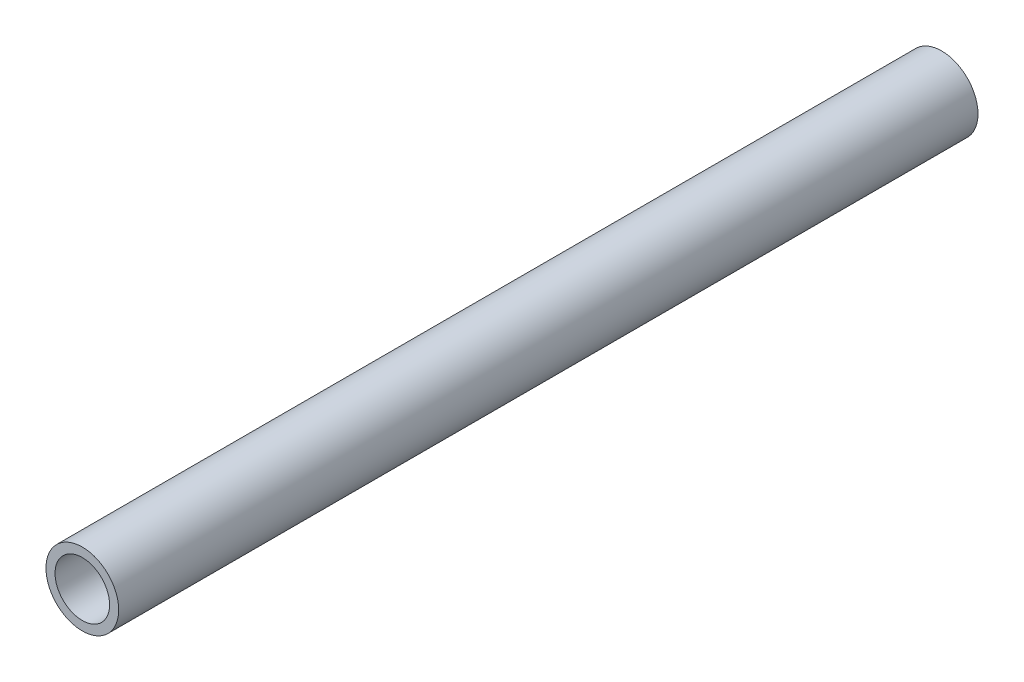
ISO-10303-21;
HEADER;
FILE_DESCRIPTION(('STEP AP214'),'2;1');
FILE_NAME('part.step','',(''),(''),'','','');
FILE_SCHEMA(('AUTOMOTIVE_DESIGN { 1 0 10303 214 1 1 1 1 }'));
ENDSEC;
DATA;
#1=APPLICATION_CONTEXT('core data for automotive mechanical design processes');
#2=APPLICATION_PROTOCOL_DEFINITION('international standard','automotive_design',2000,#1);
#3=PRODUCT_CONTEXT('',#1,'mechanical');
#4=PRODUCT('Part','Part','',(#3));
#5=PRODUCT_RELATED_PRODUCT_CATEGORY('part','',(#4));
#6=PRODUCT_DEFINITION_FORMATION('','',#4);
#7=PRODUCT_DEFINITION_CONTEXT('part definition',#1,'design');
#8=PRODUCT_DEFINITION('design','',#6,#7);
#9=PRODUCT_DEFINITION_SHAPE('','',#8);
#10=(LENGTH_UNIT() NAMED_UNIT(*) SI_UNIT(.MILLI.,.METRE.));
#11=(NAMED_UNIT(*) PLANE_ANGLE_UNIT() SI_UNIT($,.RADIAN.));
#12=(NAMED_UNIT(*) SI_UNIT($,.STERADIAN.) SOLID_ANGLE_UNIT());
#13=UNCERTAINTY_MEASURE_WITH_UNIT(LENGTH_MEASURE(1.E-05),#10,'distance_accuracy_value','');
#14=(GEOMETRIC_REPRESENTATION_CONTEXT(3) GLOBAL_UNCERTAINTY_ASSIGNED_CONTEXT((#13)) GLOBAL_UNIT_ASSIGNED_CONTEXT((#10,
#11,#12)) REPRESENTATION_CONTEXT('',''));
#15=CARTESIAN_POINT('',(0.,0.,0.));
#16=DIRECTION('',(0.,0.,1.));
#17=DIRECTION('',(1.,0.,0.));
#18=AXIS2_PLACEMENT_3D('',#15,#16,#17);
#19=CARTESIAN_POINT('',(0.,0.,150.));
#20=DIRECTION('',(0.,0.,1.));
#21=DIRECTION('',(1.,0.,0.));
#22=AXIS2_PLACEMENT_3D('',#19,#20,#21);
#23=PLANE('',#22);
#24=CARTESIAN_POINT('',(0.,0.,150.));
#25=DIRECTION('',(0.,0.,1.));
#26=DIRECTION('',(1.,0.,0.));
#27=AXIS2_PLACEMENT_3D('',#24,#25,#26);
#28=CIRCLE('',#27,6.35);
#29=CARTESIAN_POINT('',(6.35,0.,150.));
#30=VERTEX_POINT('',#29);
#31=EDGE_CURVE('E10',#30,#30,#28,.T.);
#32=ORIENTED_EDGE('',*,*,#31,.T.);
#33=EDGE_LOOP('',(#32));
#34=FACE_BOUND('',#33,.T.);
#35=CARTESIAN_POINT('',(0.,0.,150.));
#36=DIRECTION('',(0.,0.,1.));
#37=DIRECTION('',(1.,0.,0.));
#38=AXIS2_PLACEMENT_3D('',#35,#36,#37);
#39=CIRCLE('',#38,4.7625);
#40=CARTESIAN_POINT('',(4.7625,0.,150.));
#41=VERTEX_POINT('',#40);
#42=EDGE_CURVE('E48',#41,#41,#39,.T.);
#43=ORIENTED_EDGE('',*,*,#42,.F.);
#44=EDGE_LOOP('',(#43));
#45=FACE_BOUND('',#44,.T.);
#46=ADVANCED_FACE('F37',(#34,#45),#23,.T.);
#47=CARTESIAN_POINT('',(0.,0.,0.));
#48=DIRECTION('',(0.,0.,1.));
#49=DIRECTION('',(1.,0.,0.));
#50=AXIS2_PLACEMENT_3D('',#47,#48,#49);
#51=PLANE('',#50);
#52=CARTESIAN_POINT('',(0.,0.,0.));
#53=DIRECTION('',(0.,0.,1.));
#54=DIRECTION('',(1.,0.,0.));
#55=AXIS2_PLACEMENT_3D('',#52,#53,#54);
#56=CIRCLE('',#55,6.35);
#57=CARTESIAN_POINT('',(6.35,0.,0.));
#58=VERTEX_POINT('',#57);
#59=EDGE_CURVE('E41',#58,#58,#56,.T.);
#60=ORIENTED_EDGE('',*,*,#59,.F.);
#61=EDGE_LOOP('',(#60));
#62=FACE_BOUND('',#61,.T.);
#63=CARTESIAN_POINT('',(0.,0.,0.));
#64=DIRECTION('',(0.,0.,1.));
#65=DIRECTION('',(1.,0.,0.));
#66=AXIS2_PLACEMENT_3D('',#63,#64,#65);
#67=CIRCLE('',#66,4.7625);
#68=CARTESIAN_POINT('',(4.7625,0.,0.));
#69=VERTEX_POINT('',#68);
#70=EDGE_CURVE('E50',#69,#69,#67,.T.);
#71=ORIENTED_EDGE('',*,*,#70,.T.);
#72=EDGE_LOOP('',(#71));
#73=FACE_BOUND('',#72,.T.);
#74=ADVANCED_FACE('F60',(#62,#73),#51,.F.);
#75=CARTESIAN_POINT('',(0.,0.,150.));
#76=DIRECTION('',(0.,0.,-1.));
#77=DIRECTION('',(-1.,0.,0.));
#78=AXIS2_PLACEMENT_3D('',#75,#76,#77);
#79=CYLINDRICAL_SURFACE('',#78,6.35);
#80=ORIENTED_EDGE('',*,*,#31,.F.);
#81=EDGE_LOOP('',(#80));
#82=FACE_BOUND('',#81,.T.);
#83=ORIENTED_EDGE('',*,*,#59,.T.);
#84=EDGE_LOOP('',(#83));
#85=FACE_BOUND('',#84,.T.);
#86=ADVANCED_FACE('F39',(#82,#85),#79,.T.);
#87=CARTESIAN_POINT('',(0.,0.,150.));
#88=DIRECTION('',(0.,0.,-1.));
#89=DIRECTION('',(-1.,0.,0.));
#90=AXIS2_PLACEMENT_3D('',#87,#88,#89);
#91=CYLINDRICAL_SURFACE('',#90,4.7625);
#92=ORIENTED_EDGE('',*,*,#42,.T.);
#93=EDGE_LOOP('',(#92));
#94=FACE_BOUND('',#93,.T.);
#95=ORIENTED_EDGE('',*,*,#70,.F.);
#96=EDGE_LOOP('',(#95));
#97=FACE_BOUND('',#96,.T.);
#98=ADVANCED_FACE('F56',(#94,#97),#91,.F.);
#99=CLOSED_SHELL('',(#46,#74,#86,#98));
#100=MANIFOLD_SOLID_BREP('B2',#99);
#101=ADVANCED_BREP_SHAPE_REPRESENTATION('',(#18,#100),#14);
#102=SHAPE_DEFINITION_REPRESENTATION(#9,#101);
ENDSEC;
END-ISO-10303-21;
